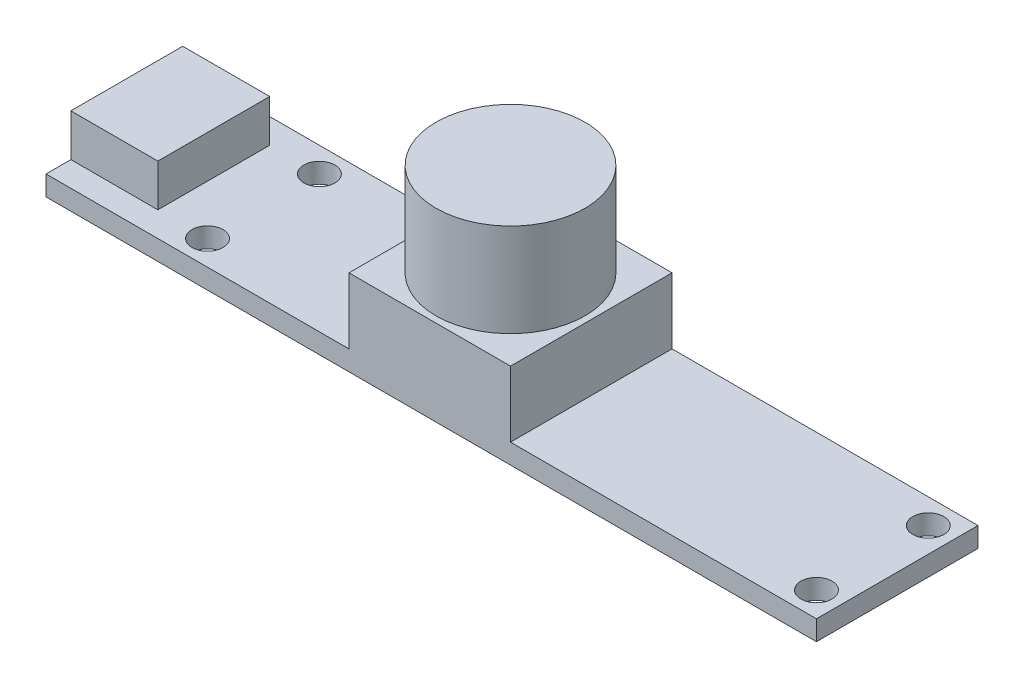
ISO-10303-21;
HEADER;
FILE_DESCRIPTION(('STEP AP214'),'2;1');
FILE_NAME('part.step','',(''),(''),'','','');
FILE_SCHEMA(('AUTOMOTIVE_DESIGN { 1 0 10303 214 1 1 1 1 }'));
ENDSEC;
DATA;
#1=APPLICATION_CONTEXT('core data for automotive mechanical design processes');
#2=APPLICATION_PROTOCOL_DEFINITION('international standard','automotive_design',2000,#1);
#3=PRODUCT_CONTEXT('',#1,'mechanical');
#4=PRODUCT('Part','Part','',(#3));
#5=PRODUCT_RELATED_PRODUCT_CATEGORY('part','',(#4));
#6=PRODUCT_DEFINITION_FORMATION('','',#4);
#7=PRODUCT_DEFINITION_CONTEXT('part definition',#1,'design');
#8=PRODUCT_DEFINITION('design','',#6,#7);
#9=PRODUCT_DEFINITION_SHAPE('','',#8);
#10=(LENGTH_UNIT() NAMED_UNIT(*) SI_UNIT(.MILLI.,.METRE.));
#11=(NAMED_UNIT(*) PLANE_ANGLE_UNIT() SI_UNIT($,.RADIAN.));
#12=(NAMED_UNIT(*) SI_UNIT($,.STERADIAN.) SOLID_ANGLE_UNIT());
#13=UNCERTAINTY_MEASURE_WITH_UNIT(LENGTH_MEASURE(1.E-05),#10,'distance_accuracy_value','');
#14=(GEOMETRIC_REPRESENTATION_CONTEXT(3) GLOBAL_UNCERTAINTY_ASSIGNED_CONTEXT((#13)) GLOBAL_UNIT_ASSIGNED_CONTEXT((#10,
#11,#12)) REPRESENTATION_CONTEXT('',''));
#15=CARTESIAN_POINT('',(0.,0.,0.));
#16=DIRECTION('',(0.,0.,1.));
#17=DIRECTION('',(1.,0.,0.));
#18=AXIS2_PLACEMENT_3D('',#15,#16,#17);
#19=CARTESIAN_POINT('',(0.,1.6,0.));
#20=DIRECTION('',(0.,1.,0.));
#21=DIRECTION('',(0.,0.,1.));
#22=AXIS2_PLACEMENT_3D('',#19,#20,#21);
#23=PLANE('',#22);
#24=CARTESIAN_POINT('',(11.,1.6,-11.));
#25=DIRECTION('',(0.,1.,0.));
#26=DIRECTION('',(0.,0.,1.));
#27=AXIS2_PLACEMENT_3D('',#24,#25,#26);
#28=CIRCLE('',#27,1.25);
#29=CARTESIAN_POINT('',(11.,1.6,-9.75));
#30=VERTEX_POINT('',#29);
#31=EDGE_CURVE('E188',#30,#30,#28,.T.);
#32=ORIENTED_EDGE('',*,*,#31,.F.);
#33=EDGE_LOOP('',(#32));
#34=FACE_BOUND('',#33,.T.);
#35=CARTESIAN_POINT('',(11.,1.6,-2.));
#36=DIRECTION('',(0.,1.,0.));
#37=DIRECTION('',(0.,0.,1.));
#38=AXIS2_PLACEMENT_3D('',#35,#36,#37);
#39=CIRCLE('',#38,1.25);
#40=CARTESIAN_POINT('',(11.,1.6,-0.750000000000001));
#41=VERTEX_POINT('',#40);
#42=EDGE_CURVE('E192',#41,#41,#39,.T.);
#43=ORIENTED_EDGE('',*,*,#42,.F.);
#44=EDGE_LOOP('',(#43));
#45=FACE_BOUND('',#44,.T.);
#46=DIRECTION('',(0.,0.,-1.));
#47=VECTOR('',#46,1.);
#48=CARTESIAN_POINT('',(7.,1.6,-11.));
#49=LINE('',#48,#47);
#50=CARTESIAN_POINT('',(7.,1.6,-2.));
#51=VERTEX_POINT('',#50);
#52=CARTESIAN_POINT('',(7.,1.6,-11.));
#53=VERTEX_POINT('',#52);
#54=EDGE_CURVE('E411',#51,#53,#49,.T.);
#55=ORIENTED_EDGE('',*,*,#54,.F.);
#56=DIRECTION('',(1.,0.,0.));
#57=VECTOR('',#56,1.);
#58=CARTESIAN_POINT('',(0.,1.6,-2.));
#59=LINE('',#58,#57);
#60=CARTESIAN_POINT('',(0.,1.6,-2.));
#61=VERTEX_POINT('',#60);
#62=EDGE_CURVE('E321',#61,#51,#59,.T.);
#63=ORIENTED_EDGE('',*,*,#62,.F.);
#64=DIRECTION('',(0.,0.,1.));
#65=VECTOR('',#64,1.);
#66=CARTESIAN_POINT('',(0.,1.6,0.));
#67=LINE('',#66,#65);
#68=CARTESIAN_POINT('',(0.,1.6,0.));
#69=VERTEX_POINT('',#68);
#70=EDGE_CURVE('E177',#61,#69,#67,.T.);
#71=ORIENTED_EDGE('',*,*,#70,.T.);
#72=DIRECTION('',(1.,0.,0.));
#73=VECTOR('',#72,1.);
#74=CARTESIAN_POINT('',(0.,1.6,0.));
#75=LINE('',#74,#73);
#76=CARTESIAN_POINT('',(24.38,1.6,0.));
#77=VERTEX_POINT('',#76);
#78=EDGE_CURVE('E197',#69,#77,#75,.T.);
#79=ORIENTED_EDGE('',*,*,#78,.T.);
#80=DIRECTION('',(0.,0.,-1.));
#81=VECTOR('',#80,1.);
#82=CARTESIAN_POINT('',(24.38,1.6,0.));
#83=LINE('',#82,#81);
#84=CARTESIAN_POINT('',(24.38,1.6,-13.));
#85=VERTEX_POINT('',#84);
#86=EDGE_CURVE('E85',#77,#85,#83,.T.);
#87=ORIENTED_EDGE('',*,*,#86,.T.);
#88=DIRECTION('',(1.,0.,0.));
#89=VECTOR('',#88,1.);
#90=CARTESIAN_POINT('',(0.,1.6,-13.));
#91=LINE('',#90,#89);
#92=CARTESIAN_POINT('',(0.,1.6,-13.));
#93=VERTEX_POINT('',#92);
#94=EDGE_CURVE('E203',#93,#85,#91,.T.);
#95=ORIENTED_EDGE('',*,*,#94,.F.);
#96=CARTESIAN_POINT('',(0.,1.6,-11.));
#97=VERTEX_POINT('',#96);
#98=EDGE_CURVE('E207',#93,#97,#67,.T.);
#99=ORIENTED_EDGE('',*,*,#98,.T.);
#100=DIRECTION('',(-1.,0.,0.));
#101=VECTOR('',#100,1.);
#102=CARTESIAN_POINT('',(0.,1.6,-11.));
#103=LINE('',#102,#101);
#104=EDGE_CURVE('E171',#53,#97,#103,.T.);
#105=ORIENTED_EDGE('',*,*,#104,.F.);
#106=EDGE_LOOP('',(#55,#63,#71,#79,#87,#95,#99,#105));
#107=FACE_BOUND('',#106,.T.);
#108=ADVANCED_FACE('F60',(#34,#45,#107),#23,.T.);
#109=CARTESIAN_POINT('',(0.,1.6,0.));
#110=DIRECTION('',(0.,0.,-1.));
#111=DIRECTION('',(-1.,0.,0.));
#112=AXIS2_PLACEMENT_3D('',#109,#110,#111);
#113=PLANE('',#112);
#114=DIRECTION('',(1.,0.,0.));
#115=VECTOR('',#114,1.);
#116=CARTESIAN_POINT('',(0.,0.,0.));
#117=LINE('',#116,#115);
#118=CARTESIAN_POINT('',(0.,0.,0.));
#119=VERTEX_POINT('',#118);
#120=CARTESIAN_POINT('',(62.,0.,0.));
#121=VERTEX_POINT('',#120);
#122=EDGE_CURVE('E290',#119,#121,#117,.T.);
#123=ORIENTED_EDGE('',*,*,#122,.T.);
#124=DIRECTION('',(0.,-1.,0.));
#125=VECTOR('',#124,1.);
#126=CARTESIAN_POINT('',(62.,1.6,0.));
#127=LINE('',#126,#125);
#128=CARTESIAN_POINT('',(62.,1.6,0.));
#129=VERTEX_POINT('',#128);
#130=EDGE_CURVE('E12',#129,#121,#127,.T.);
#131=ORIENTED_EDGE('',*,*,#130,.F.);
#132=DIRECTION('',(1.,0.,0.));
#133=VECTOR('',#132,1.);
#134=CARTESIAN_POINT('',(0.,1.6,0.));
#135=LINE('',#134,#133);
#136=CARTESIAN_POINT('',(37.38,1.6,0.));
#137=VERTEX_POINT('',#136);
#138=EDGE_CURVE('E272',#137,#129,#135,.T.);
#139=ORIENTED_EDGE('',*,*,#138,.F.);
#140=DIRECTION('',(0.,-1.,0.));
#141=VECTOR('',#140,1.);
#142=CARTESIAN_POINT('',(37.38,6.9,0.));
#143=LINE('',#142,#141);
#144=CARTESIAN_POINT('',(37.38,6.9,0.));
#145=VERTEX_POINT('',#144);
#146=EDGE_CURVE('E254',#145,#137,#143,.T.);
#147=ORIENTED_EDGE('',*,*,#146,.F.);
#148=DIRECTION('',(1.,0.,0.));
#149=VECTOR('',#148,1.);
#150=CARTESIAN_POINT('',(0.,6.9,0.));
#151=LINE('',#150,#149);
#152=CARTESIAN_POINT('',(24.38,6.9,0.));
#153=VERTEX_POINT('',#152);
#154=EDGE_CURVE('E229',#153,#145,#151,.T.);
#155=ORIENTED_EDGE('',*,*,#154,.F.);
#156=DIRECTION('',(0.,-1.,0.));
#157=VECTOR('',#156,1.);
#158=CARTESIAN_POINT('',(24.38,6.9,0.));
#159=LINE('',#158,#157);
#160=EDGE_CURVE('E244',#153,#77,#159,.T.);
#161=ORIENTED_EDGE('',*,*,#160,.T.);
#162=ORIENTED_EDGE('',*,*,#78,.F.);
#163=DIRECTION('',(0.,-1.,0.));
#164=VECTOR('',#163,1.);
#165=CARTESIAN_POINT('',(0.,1.6,0.));
#166=LINE('',#165,#164);
#167=EDGE_CURVE('E211',#69,#119,#166,.T.);
#168=ORIENTED_EDGE('',*,*,#167,.T.);
#169=EDGE_LOOP('',(#123,#131,#139,#147,#155,#161,#162,#168));
#170=FACE_BOUND('',#169,.T.);
#171=ADVANCED_FACE('F316',(#170),#113,.F.);
#172=CARTESIAN_POINT('',(62.,1.6,0.));
#173=DIRECTION('',(1.,0.,0.));
#174=DIRECTION('',(0.,0.,-1.));
#175=AXIS2_PLACEMENT_3D('',#172,#173,#174);
#176=PLANE('',#175);
#177=DIRECTION('',(0.,0.,1.));
#178=VECTOR('',#177,1.);
#179=CARTESIAN_POINT('',(62.,0.,0.));
#180=LINE('',#179,#178);
#181=CARTESIAN_POINT('',(62.,0.,-13.));
#182=VERTEX_POINT('',#181);
#183=EDGE_CURVE('E294',#182,#121,#180,.T.);
#184=ORIENTED_EDGE('',*,*,#183,.F.);
#185=DIRECTION('',(0.,-1.,0.));
#186=VECTOR('',#185,1.);
#187=CARTESIAN_POINT('',(62.,1.6,-13.));
#188=LINE('',#187,#186);
#189=CARTESIAN_POINT('',(62.,1.6,-13.));
#190=VERTEX_POINT('',#189);
#191=EDGE_CURVE('E70',#190,#182,#188,.T.);
#192=ORIENTED_EDGE('',*,*,#191,.F.);
#193=DIRECTION('',(0.,0.,1.));
#194=VECTOR('',#193,1.);
#195=CARTESIAN_POINT('',(62.,1.6,0.));
#196=LINE('',#195,#194);
#197=EDGE_CURVE('E275',#190,#129,#196,.T.);
#198=ORIENTED_EDGE('',*,*,#197,.T.);
#199=ORIENTED_EDGE('',*,*,#130,.T.);
#200=EDGE_LOOP('',(#184,#192,#198,#199));
#201=FACE_BOUND('',#200,.T.);
#202=ADVANCED_FACE('F307',(#201),#176,.T.);
#203=CARTESIAN_POINT('',(60.,1.6,-11.));
#204=DIRECTION('',(0.,-1.,0.));
#205=DIRECTION('',(0.,0.,-1.));
#206=AXIS2_PLACEMENT_3D('',#203,#204,#205);
#207=CYLINDRICAL_SURFACE('',#206,1.25);
#208=CARTESIAN_POINT('',(60.,1.6,-11.));
#209=DIRECTION('',(0.,1.,0.));
#210=DIRECTION('',(0.,0.,1.));
#211=AXIS2_PLACEMENT_3D('',#208,#209,#210);
#212=CIRCLE('',#211,1.25);
#213=CARTESIAN_POINT('',(60.,1.6,-9.75));
#214=VERTEX_POINT('',#213);
#215=EDGE_CURVE('E263',#214,#214,#212,.T.);
#216=ORIENTED_EDGE('',*,*,#215,.T.);
#217=EDGE_LOOP('',(#216));
#218=FACE_BOUND('',#217,.T.);
#219=CARTESIAN_POINT('',(60.,0.,-11.));
#220=DIRECTION('',(0.,1.,0.));
#221=DIRECTION('',(0.,0.,1.));
#222=AXIS2_PLACEMENT_3D('',#219,#220,#221);
#223=CIRCLE('',#222,1.25);
#224=CARTESIAN_POINT('',(60.,0.,-9.75));
#225=VERTEX_POINT('',#224);
#226=EDGE_CURVE('E286',#225,#225,#223,.T.);
#227=ORIENTED_EDGE('',*,*,#226,.F.);
#228=EDGE_LOOP('',(#227));
#229=FACE_BOUND('',#228,.T.);
#230=ADVANCED_FACE('F383',(#218,#229),#207,.F.);
#231=CARTESIAN_POINT('',(60.,1.6,-2.));
#232=DIRECTION('',(0.,-1.,0.));
#233=DIRECTION('',(0.,0.,-1.));
#234=AXIS2_PLACEMENT_3D('',#231,#232,#233);
#235=CYLINDRICAL_SURFACE('',#234,1.25000000000001);
#236=CARTESIAN_POINT('',(60.,1.6,-2.));
#237=DIRECTION('',(0.,1.,0.));
#238=DIRECTION('',(0.,0.,1.));
#239=AXIS2_PLACEMENT_3D('',#236,#237,#238);
#240=CIRCLE('',#239,1.25000000000001);
#241=CARTESIAN_POINT('',(60.,1.6,-0.749999999999995));
#242=VERTEX_POINT('',#241);
#243=EDGE_CURVE('E259',#242,#242,#240,.T.);
#244=ORIENTED_EDGE('',*,*,#243,.T.);
#245=EDGE_LOOP('',(#244));
#246=FACE_BOUND('',#245,.T.);
#247=CARTESIAN_POINT('',(60.,0.,-2.));
#248=DIRECTION('',(0.,1.,0.));
#249=DIRECTION('',(0.,0.,1.));
#250=AXIS2_PLACEMENT_3D('',#247,#248,#249);
#251=CIRCLE('',#250,1.25000000000001);
#252=CARTESIAN_POINT('',(60.,0.,-0.749999999999995));
#253=VERTEX_POINT('',#252);
#254=EDGE_CURVE('E258',#253,#253,#251,.T.);
#255=ORIENTED_EDGE('',*,*,#254,.F.);
#256=EDGE_LOOP('',(#255));
#257=FACE_BOUND('',#256,.T.);
#258=ADVANCED_FACE('F62',(#246,#257),#235,.F.);
#259=CARTESIAN_POINT('',(0.,1.6,-13.));
#260=DIRECTION('',(0.,0.,-1.));
#261=DIRECTION('',(-1.,0.,0.));
#262=AXIS2_PLACEMENT_3D('',#259,#260,#261);
#263=PLANE('',#262);
#264=DIRECTION('',(1.,0.,0.));
#265=VECTOR('',#264,1.);
#266=CARTESIAN_POINT('',(0.,0.,-13.));
#267=LINE('',#266,#265);
#268=CARTESIAN_POINT('',(0.,0.,-13.));
#269=VERTEX_POINT('',#268);
#270=EDGE_CURVE('E264',#269,#182,#267,.T.);
#271=ORIENTED_EDGE('',*,*,#270,.F.);
#272=DIRECTION('',(0.,-1.,0.));
#273=VECTOR('',#272,1.);
#274=CARTESIAN_POINT('',(0.,1.6,-13.));
#275=LINE('',#274,#273);
#276=EDGE_CURVE('E225',#93,#269,#275,.T.);
#277=ORIENTED_EDGE('',*,*,#276,.F.);
#278=ORIENTED_EDGE('',*,*,#94,.T.);
#279=DIRECTION('',(0.,-1.,0.));
#280=VECTOR('',#279,1.);
#281=CARTESIAN_POINT('',(24.38,6.9,-13.));
#282=LINE('',#281,#280);
#283=CARTESIAN_POINT('',(24.38,6.9,-13.));
#284=VERTEX_POINT('',#283);
#285=EDGE_CURVE('E247',#284,#85,#282,.T.);
#286=ORIENTED_EDGE('',*,*,#285,.F.);
#287=DIRECTION('',(1.,0.,0.));
#288=VECTOR('',#287,1.);
#289=CARTESIAN_POINT('',(0.,6.9,-13.));
#290=LINE('',#289,#288);
#291=CARTESIAN_POINT('',(37.38,6.9,-13.));
#292=VERTEX_POINT('',#291);
#293=EDGE_CURVE('E236',#284,#292,#290,.T.);
#294=ORIENTED_EDGE('',*,*,#293,.T.);
#295=DIRECTION('',(0.,-1.,0.));
#296=VECTOR('',#295,1.);
#297=CARTESIAN_POINT('',(37.38,6.9,-13.));
#298=LINE('',#297,#296);
#299=CARTESIAN_POINT('',(37.38,1.6,-13.));
#300=VERTEX_POINT('',#299);
#301=EDGE_CURVE('E250',#292,#300,#298,.T.);
#302=ORIENTED_EDGE('',*,*,#301,.T.);
#303=DIRECTION('',(1.,0.,0.));
#304=VECTOR('',#303,1.);
#305=CARTESIAN_POINT('',(0.,1.6,-13.));
#306=LINE('',#305,#304);
#307=EDGE_CURVE('E279',#300,#190,#306,.T.);
#308=ORIENTED_EDGE('',*,*,#307,.T.);
#309=ORIENTED_EDGE('',*,*,#191,.T.);
#310=EDGE_LOOP('',(#271,#277,#278,#286,#294,#302,#308,#309));
#311=FACE_BOUND('',#310,.T.);
#312=ADVANCED_FACE('F304',(#311),#263,.T.);
#313=CARTESIAN_POINT('',(0.,1.6,0.));
#314=DIRECTION('',(0.,1.,0.));
#315=DIRECTION('',(0.,0.,1.));
#316=AXIS2_PLACEMENT_3D('',#313,#314,#315);
#317=PLANE('',#316);
#318=ORIENTED_EDGE('',*,*,#243,.F.);
#319=EDGE_LOOP('',(#318));
#320=FACE_BOUND('',#319,.T.);
#321=ORIENTED_EDGE('',*,*,#215,.F.);
#322=EDGE_LOOP('',(#321));
#323=FACE_BOUND('',#322,.T.);
#324=DIRECTION('',(0.,0.,-1.));
#325=VECTOR('',#324,1.);
#326=CARTESIAN_POINT('',(37.38,1.6,0.));
#327=LINE('',#326,#325);
#328=EDGE_CURVE('E268',#137,#300,#327,.T.);
#329=ORIENTED_EDGE('',*,*,#328,.F.);
#330=ORIENTED_EDGE('',*,*,#138,.T.);
#331=ORIENTED_EDGE('',*,*,#197,.F.);
#332=ORIENTED_EDGE('',*,*,#307,.F.);
#333=EDGE_LOOP('',(#329,#330,#331,#332));
#334=FACE_BOUND('',#333,.T.);
#335=ADVANCED_FACE('F373',(#320,#323,#334),#317,.T.);
#336=CARTESIAN_POINT('',(0.,0.,0.));
#337=DIRECTION('',(0.,1.,0.));
#338=DIRECTION('',(0.,0.,1.));
#339=AXIS2_PLACEMENT_3D('',#336,#337,#338);
#340=PLANE('',#339);
#341=ORIENTED_EDGE('',*,*,#254,.T.);
#342=EDGE_LOOP('',(#341));
#343=FACE_BOUND('',#342,.T.);
#344=ORIENTED_EDGE('',*,*,#226,.T.);
#345=EDGE_LOOP('',(#344));
#346=FACE_BOUND('',#345,.T.);
#347=ORIENTED_EDGE('',*,*,#122,.F.);
#348=DIRECTION('',(0.,0.,1.));
#349=VECTOR('',#348,1.);
#350=CARTESIAN_POINT('',(0.,0.,0.));
#351=LINE('',#350,#349);
#352=EDGE_CURVE('E193',#269,#119,#351,.T.);
#353=ORIENTED_EDGE('',*,*,#352,.F.);
#354=ORIENTED_EDGE('',*,*,#270,.T.);
#355=ORIENTED_EDGE('',*,*,#183,.T.);
#356=EDGE_LOOP('',(#347,#353,#354,#355));
#357=FACE_BOUND('',#356,.T.);
#358=CARTESIAN_POINT('',(11.,0.,-11.));
#359=DIRECTION('',(0.,1.,0.));
#360=DIRECTION('',(0.,0.,1.));
#361=AXIS2_PLACEMENT_3D('',#358,#359,#360);
#362=CIRCLE('',#361,1.25);
#363=CARTESIAN_POINT('',(11.,0.,-9.75));
#364=VERTEX_POINT('',#363);
#365=EDGE_CURVE('E212',#364,#364,#362,.T.);
#366=ORIENTED_EDGE('',*,*,#365,.T.);
#367=EDGE_LOOP('',(#366));
#368=FACE_BOUND('',#367,.T.);
#369=CARTESIAN_POINT('',(11.,0.,-2.));
#370=DIRECTION('',(0.,1.,0.));
#371=DIRECTION('',(0.,0.,1.));
#372=AXIS2_PLACEMENT_3D('',#369,#370,#371);
#373=CIRCLE('',#372,1.25);
#374=CARTESIAN_POINT('',(11.,0.,-0.750000000000001));
#375=VERTEX_POINT('',#374);
#376=EDGE_CURVE('E216',#375,#375,#373,.T.);
#377=ORIENTED_EDGE('',*,*,#376,.T.);
#378=EDGE_LOOP('',(#377));
#379=FACE_BOUND('',#378,.T.);
#380=ADVANCED_FACE('F311',(#343,#346,#357,#368,#379),#340,.F.);
#381=CARTESIAN_POINT('',(37.38,6.9,0.));
#382=DIRECTION('',(-1.,0.,0.));
#383=DIRECTION('',(0.,0.,1.));
#384=AXIS2_PLACEMENT_3D('',#381,#382,#383);
#385=PLANE('',#384);
#386=ORIENTED_EDGE('',*,*,#146,.T.);
#387=ORIENTED_EDGE('',*,*,#328,.T.);
#388=ORIENTED_EDGE('',*,*,#301,.F.);
#389=DIRECTION('',(0.,0.,-1.));
#390=VECTOR('',#389,1.);
#391=CARTESIAN_POINT('',(37.38,6.9,0.));
#392=LINE('',#391,#390);
#393=EDGE_CURVE('E233',#145,#292,#392,.T.);
#394=ORIENTED_EDGE('',*,*,#393,.F.);
#395=EDGE_LOOP('',(#386,#387,#388,#394));
#396=FACE_BOUND('',#395,.T.);
#397=ADVANCED_FACE('F369',(#396),#385,.F.);
#398=CARTESIAN_POINT('',(24.38,6.9,0.));
#399=DIRECTION('',(-1.,0.,0.));
#400=DIRECTION('',(0.,0.,1.));
#401=AXIS2_PLACEMENT_3D('',#398,#399,#400);
#402=PLANE('',#401);
#403=ORIENTED_EDGE('',*,*,#86,.F.);
#404=ORIENTED_EDGE('',*,*,#160,.F.);
#405=DIRECTION('',(0.,0.,-1.));
#406=VECTOR('',#405,1.);
#407=CARTESIAN_POINT('',(24.38,6.9,0.));
#408=LINE('',#407,#406);
#409=EDGE_CURVE('E240',#153,#284,#408,.T.);
#410=ORIENTED_EDGE('',*,*,#409,.T.);
#411=ORIENTED_EDGE('',*,*,#285,.T.);
#412=EDGE_LOOP('',(#403,#404,#410,#411));
#413=FACE_BOUND('',#412,.T.);
#414=ADVANCED_FACE('F366',(#413),#402,.T.);
#415=CARTESIAN_POINT('',(0.,6.9,0.));
#416=DIRECTION('',(0.,1.,0.));
#417=DIRECTION('',(0.,0.,1.));
#418=AXIS2_PLACEMENT_3D('',#415,#416,#417);
#419=PLANE('',#418);
#420=CARTESIAN_POINT('',(30.88,6.9,-6.5));
#421=DIRECTION('',(0.,1.,0.));
#422=DIRECTION('',(0.,0.,1.));
#423=AXIS2_PLACEMENT_3D('',#420,#421,#422);
#424=CIRCLE('',#423,5.99999999999999);
#425=CARTESIAN_POINT('',(30.88,6.9,-0.5));
#426=VERTEX_POINT('',#425);
#427=EDGE_CURVE('E64',#426,#426,#424,.F.);
#428=ORIENTED_EDGE('',*,*,#427,.T.);
#429=EDGE_LOOP('',(#428));
#430=FACE_BOUND('',#429,.T.);
#431=ORIENTED_EDGE('',*,*,#154,.T.);
#432=ORIENTED_EDGE('',*,*,#393,.T.);
#433=ORIENTED_EDGE('',*,*,#293,.F.);
#434=ORIENTED_EDGE('',*,*,#409,.F.);
#435=EDGE_LOOP('',(#431,#432,#433,#434));
#436=FACE_BOUND('',#435,.T.);
#437=ADVANCED_FACE('F327',(#430,#436),#419,.T.);
#438=CARTESIAN_POINT('',(11.,1.6,-2.));
#439=DIRECTION('',(0.,-1.,0.));
#440=DIRECTION('',(0.,0.,-1.));
#441=AXIS2_PLACEMENT_3D('',#438,#439,#440);
#442=CYLINDRICAL_SURFACE('',#441,1.25);
#443=ORIENTED_EDGE('',*,*,#42,.T.);
#444=EDGE_LOOP('',(#443));
#445=FACE_BOUND('',#444,.T.);
#446=ORIENTED_EDGE('',*,*,#376,.F.);
#447=EDGE_LOOP('',(#446));
#448=FACE_BOUND('',#447,.T.);
#449=ADVANCED_FACE('F357',(#445,#448),#442,.F.);
#450=CARTESIAN_POINT('',(11.,1.6,-11.));
#451=DIRECTION('',(0.,-1.,0.));
#452=DIRECTION('',(0.,0.,-1.));
#453=AXIS2_PLACEMENT_3D('',#450,#451,#452);
#454=CYLINDRICAL_SURFACE('',#453,1.25);
#455=ORIENTED_EDGE('',*,*,#31,.T.);
#456=EDGE_LOOP('',(#455));
#457=FACE_BOUND('',#456,.T.);
#458=ORIENTED_EDGE('',*,*,#365,.F.);
#459=EDGE_LOOP('',(#458));
#460=FACE_BOUND('',#459,.T.);
#461=ADVANCED_FACE('F356',(#457,#460),#454,.F.);
#462=CARTESIAN_POINT('',(0.,1.6,0.));
#463=DIRECTION('',(1.,0.,0.));
#464=DIRECTION('',(0.,0.,-1.));
#465=AXIS2_PLACEMENT_3D('',#462,#463,#464);
#466=PLANE('',#465);
#467=ORIENTED_EDGE('',*,*,#352,.T.);
#468=ORIENTED_EDGE('',*,*,#167,.F.);
#469=ORIENTED_EDGE('',*,*,#70,.F.);
#470=DIRECTION('',(0.,-1.,0.));
#471=VECTOR('',#470,1.);
#472=CARTESIAN_POINT('',(0.,5.,-2.));
#473=LINE('',#472,#471);
#474=CARTESIAN_POINT('',(0.,5.,-2.));
#475=VERTEX_POINT('',#474);
#476=EDGE_CURVE('E154',#475,#61,#473,.T.);
#477=ORIENTED_EDGE('',*,*,#476,.F.);
#478=DIRECTION('',(0.,0.,1.));
#479=VECTOR('',#478,1.);
#480=CARTESIAN_POINT('',(0.,5.,-11.));
#481=LINE('',#480,#479);
#482=CARTESIAN_POINT('',(0.,5.,-11.));
#483=VERTEX_POINT('',#482);
#484=EDGE_CURVE('E162',#483,#475,#481,.T.);
#485=ORIENTED_EDGE('',*,*,#484,.F.);
#486=DIRECTION('',(0.,-1.,0.));
#487=VECTOR('',#486,1.);
#488=CARTESIAN_POINT('',(0.,5.,-11.));
#489=LINE('',#488,#487);
#490=EDGE_CURVE('E402',#483,#97,#489,.T.);
#491=ORIENTED_EDGE('',*,*,#490,.T.);
#492=ORIENTED_EDGE('',*,*,#98,.F.);
#493=ORIENTED_EDGE('',*,*,#276,.T.);
#494=EDGE_LOOP('',(#467,#468,#469,#477,#485,#491,#492,#493));
#495=FACE_BOUND('',#494,.T.);
#496=ADVANCED_FACE('F175',(#495),#466,.F.);
#497=CARTESIAN_POINT('',(30.88,14.4,-6.5));
#498=DIRECTION('',(0.,-1.,0.));
#499=DIRECTION('',(0.,0.,-1.));
#500=AXIS2_PLACEMENT_3D('',#497,#498,#499);
#501=CYLINDRICAL_SURFACE('',#500,5.99999999999999);
#502=ORIENTED_EDGE('',*,*,#427,.F.);
#503=EDGE_LOOP('',(#502));
#504=FACE_BOUND('',#503,.T.);
#505=CARTESIAN_POINT('',(30.88,14.4,-6.5));
#506=DIRECTION('',(0.,1.,0.));
#507=DIRECTION('',(0.,0.,1.));
#508=AXIS2_PLACEMENT_3D('',#505,#506,#507);
#509=CIRCLE('',#508,5.99999999999999);
#510=CARTESIAN_POINT('',(30.88,14.4,-0.5));
#511=VERTEX_POINT('',#510);
#512=EDGE_CURVE('E179',#511,#511,#509,.T.);
#513=ORIENTED_EDGE('',*,*,#512,.F.);
#514=EDGE_LOOP('',(#513));
#515=FACE_BOUND('',#514,.T.);
#516=ADVANCED_FACE('F330',(#504,#515),#501,.T.);
#517=CARTESIAN_POINT('',(0.,14.4,0.));
#518=DIRECTION('',(0.,1.,0.));
#519=DIRECTION('',(0.,0.,1.));
#520=AXIS2_PLACEMENT_3D('',#517,#518,#519);
#521=PLANE('',#520);
#522=ORIENTED_EDGE('',*,*,#512,.T.);
#523=EDGE_LOOP('',(#522));
#524=FACE_BOUND('',#523,.T.);
#525=ADVANCED_FACE('F333',(#524),#521,.T.);
#526=CARTESIAN_POINT('',(0.,5.,-2.));
#527=DIRECTION('',(0.,0.,-1.));
#528=DIRECTION('',(-1.,0.,0.));
#529=AXIS2_PLACEMENT_3D('',#526,#527,#528);
#530=PLANE('',#529);
#531=ORIENTED_EDGE('',*,*,#62,.T.);
#532=DIRECTION('',(0.,-1.,0.));
#533=VECTOR('',#532,1.);
#534=CARTESIAN_POINT('',(7.,5.,-2.));
#535=LINE('',#534,#533);
#536=CARTESIAN_POINT('',(7.,5.,-2.));
#537=VERTEX_POINT('',#536);
#538=EDGE_CURVE('E157',#537,#51,#535,.T.);
#539=ORIENTED_EDGE('',*,*,#538,.F.);
#540=DIRECTION('',(1.,0.,0.));
#541=VECTOR('',#540,1.);
#542=CARTESIAN_POINT('',(0.,5.,-2.));
#543=LINE('',#542,#541);
#544=EDGE_CURVE('E150',#475,#537,#543,.T.);
#545=ORIENTED_EDGE('',*,*,#544,.F.);
#546=ORIENTED_EDGE('',*,*,#476,.T.);
#547=EDGE_LOOP('',(#531,#539,#545,#546));
#548=FACE_BOUND('',#547,.T.);
#549=ADVANCED_FACE('F152',(#548),#530,.F.);
#550=CARTESIAN_POINT('',(7.,5.,-11.));
#551=DIRECTION('',(-1.,0.,0.));
#552=DIRECTION('',(0.,0.,1.));
#553=AXIS2_PLACEMENT_3D('',#550,#551,#552);
#554=PLANE('',#553);
#555=ORIENTED_EDGE('',*,*,#54,.T.);
#556=DIRECTION('',(0.,-1.,0.));
#557=VECTOR('',#556,1.);
#558=CARTESIAN_POINT('',(7.,5.,-11.));
#559=LINE('',#558,#557);
#560=CARTESIAN_POINT('',(7.,5.,-11.));
#561=VERTEX_POINT('',#560);
#562=EDGE_CURVE('E77',#561,#53,#559,.T.);
#563=ORIENTED_EDGE('',*,*,#562,.F.);
#564=DIRECTION('',(0.,0.,-1.));
#565=VECTOR('',#564,1.);
#566=CARTESIAN_POINT('',(7.,5.,-11.));
#567=LINE('',#566,#565);
#568=EDGE_CURVE('E161',#537,#561,#567,.T.);
#569=ORIENTED_EDGE('',*,*,#568,.F.);
#570=ORIENTED_EDGE('',*,*,#538,.T.);
#571=EDGE_LOOP('',(#555,#563,#569,#570));
#572=FACE_BOUND('',#571,.T.);
#573=ADVANCED_FACE('F342',(#572),#554,.F.);
#574=CARTESIAN_POINT('',(0.,5.,-11.));
#575=DIRECTION('',(0.,0.,1.));
#576=DIRECTION('',(1.,0.,0.));
#577=AXIS2_PLACEMENT_3D('',#574,#575,#576);
#578=PLANE('',#577);
#579=ORIENTED_EDGE('',*,*,#104,.T.);
#580=ORIENTED_EDGE('',*,*,#490,.F.);
#581=DIRECTION('',(-1.,0.,0.));
#582=VECTOR('',#581,1.);
#583=CARTESIAN_POINT('',(0.,5.,-11.));
#584=LINE('',#583,#582);
#585=EDGE_CURVE('E166',#561,#483,#584,.T.);
#586=ORIENTED_EDGE('',*,*,#585,.F.);
#587=ORIENTED_EDGE('',*,*,#562,.T.);
#588=EDGE_LOOP('',(#579,#580,#586,#587));
#589=FACE_BOUND('',#588,.T.);
#590=ADVANCED_FACE('F418',(#589),#578,.F.);
#591=CARTESIAN_POINT('',(0.,5.,0.));
#592=DIRECTION('',(0.,1.,0.));
#593=DIRECTION('',(0.,0.,1.));
#594=AXIS2_PLACEMENT_3D('',#591,#592,#593);
#595=PLANE('',#594);
#596=ORIENTED_EDGE('',*,*,#484,.T.);
#597=ORIENTED_EDGE('',*,*,#544,.T.);
#598=ORIENTED_EDGE('',*,*,#568,.T.);
#599=ORIENTED_EDGE('',*,*,#585,.T.);
#600=EDGE_LOOP('',(#596,#597,#598,#599));
#601=FACE_BOUND('',#600,.T.);
#602=ADVANCED_FACE('F165',(#601),#595,.T.);
#603=CLOSED_SHELL('',(#108,#171,#202,#230,#258,#312,#335,#380,#397,#414,#437,#449,#461,#496,
#516,#525,#549,#573,#590,#602));
#604=MANIFOLD_SOLID_BREP('B2',#603);
#605=ADVANCED_BREP_SHAPE_REPRESENTATION('',(#18,#604),#14);
#606=SHAPE_DEFINITION_REPRESENTATION(#9,#605);
ENDSEC;
END-ISO-10303-21;
